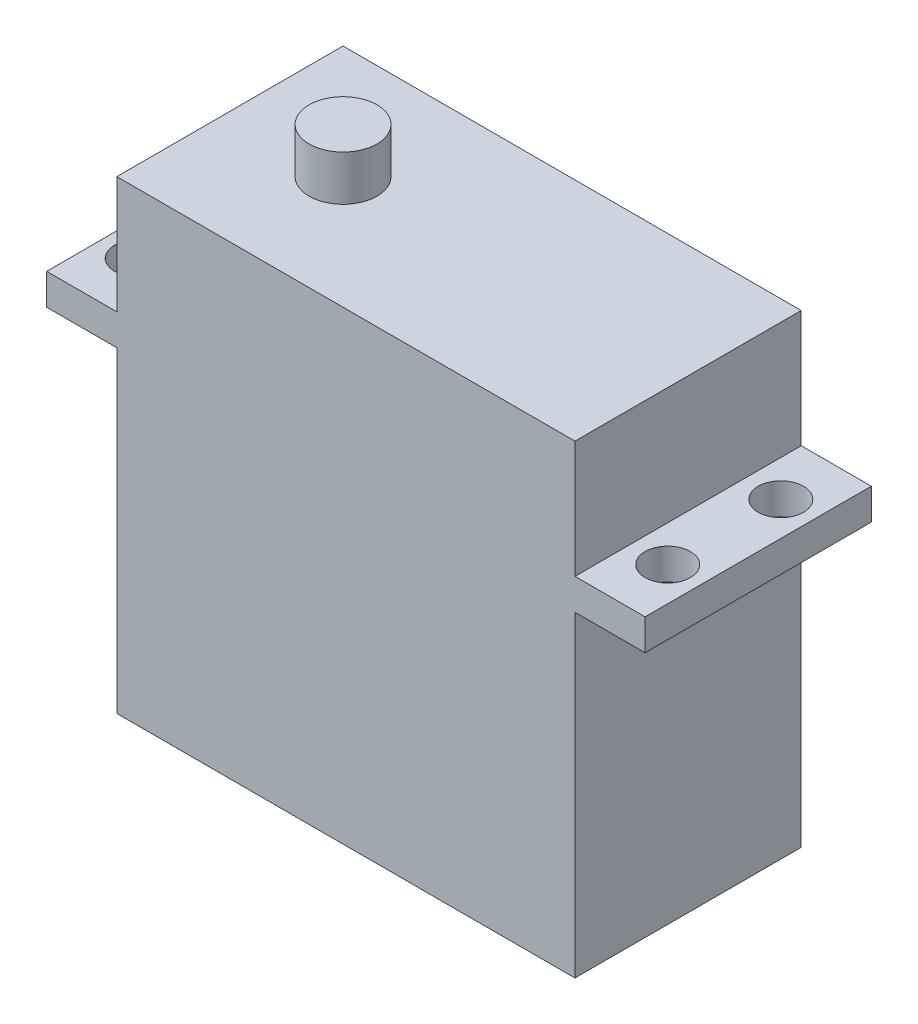
ISO-10303-21;
HEADER;
FILE_DESCRIPTION(('STEP AP214'),'2;1');
FILE_NAME('part.step','',(''),(''),'','','');
FILE_SCHEMA(('AUTOMOTIVE_DESIGN { 1 0 10303 214 1 1 1 1 }'));
ENDSEC;
DATA;
#1=APPLICATION_CONTEXT('core data for automotive mechanical design processes');
#2=APPLICATION_PROTOCOL_DEFINITION('international standard','automotive_design',2000,#1);
#3=PRODUCT_CONTEXT('',#1,'mechanical');
#4=PRODUCT('Part','Part','',(#3));
#5=PRODUCT_RELATED_PRODUCT_CATEGORY('part','',(#4));
#6=PRODUCT_DEFINITION_FORMATION('','',#4);
#7=PRODUCT_DEFINITION_CONTEXT('part definition',#1,'design');
#8=PRODUCT_DEFINITION('design','',#6,#7);
#9=PRODUCT_DEFINITION_SHAPE('','',#8);
#10=(LENGTH_UNIT() NAMED_UNIT(*) SI_UNIT(.MILLI.,.METRE.));
#11=(NAMED_UNIT(*) PLANE_ANGLE_UNIT() SI_UNIT($,.RADIAN.));
#12=(NAMED_UNIT(*) SI_UNIT($,.STERADIAN.) SOLID_ANGLE_UNIT());
#13=UNCERTAINTY_MEASURE_WITH_UNIT(LENGTH_MEASURE(1.E-05),#10,'distance_accuracy_value','');
#14=(GEOMETRIC_REPRESENTATION_CONTEXT(3) GLOBAL_UNCERTAINTY_ASSIGNED_CONTEXT((#13)) GLOBAL_UNIT_ASSIGNED_CONTEXT((#10,
#11,#12)) REPRESENTATION_CONTEXT('',''));
#15=CARTESIAN_POINT('',(0.,0.,0.));
#16=DIRECTION('',(0.,0.,1.));
#17=DIRECTION('',(1.,0.,0.));
#18=AXIS2_PLACEMENT_3D('',#15,#16,#17);
#19=CARTESIAN_POINT('',(-20.25,-20.55,-20.));
#20=DIRECTION('',(-1.,0.,0.));
#21=DIRECTION('',(0.,-1.,0.));
#22=AXIS2_PLACEMENT_3D('',#19,#20,#21);
#23=PLANE('',#22);
#24=DIRECTION('',(0.,-1.,0.));
#25=VECTOR('',#24,1.);
#26=CARTESIAN_POINT('',(-20.25,-20.55,0.));
#27=LINE('',#26,#25);
#28=CARTESIAN_POINT('',(-20.25,7.45,0.));
#29=VERTEX_POINT('',#28);
#30=CARTESIAN_POINT('',(-20.25,-20.55,0.));
#31=VERTEX_POINT('',#30);
#32=EDGE_CURVE('E200',#29,#31,#27,.T.);
#33=ORIENTED_EDGE('',*,*,#32,.F.);
#34=DIRECTION('',(0.,0.,-1.));
#35=VECTOR('',#34,1.);
#36=CARTESIAN_POINT('',(-20.25,7.45,0.));
#37=LINE('',#36,#35);
#38=CARTESIAN_POINT('',(-20.25,7.45,-20.));
#39=VERTEX_POINT('',#38);
#40=EDGE_CURVE('E145',#29,#39,#37,.T.);
#41=ORIENTED_EDGE('',*,*,#40,.T.);
#42=DIRECTION('',(0.,-1.,0.));
#43=VECTOR('',#42,1.);
#44=CARTESIAN_POINT('',(-20.25,-20.55,-20.));
#45=LINE('',#44,#43);
#46=CARTESIAN_POINT('',(-20.25,-20.55,-20.));
#47=VERTEX_POINT('',#46);
#48=EDGE_CURVE('E205',#39,#47,#45,.T.);
#49=ORIENTED_EDGE('',*,*,#48,.T.);
#50=DIRECTION('',(0.,0.,1.));
#51=VECTOR('',#50,1.);
#52=CARTESIAN_POINT('',(-20.25,-20.55,-20.));
#53=LINE('',#52,#51);
#54=EDGE_CURVE('E214',#47,#31,#53,.T.);
#55=ORIENTED_EDGE('',*,*,#54,.T.);
#56=EDGE_LOOP('',(#33,#41,#49,#55));
#57=FACE_BOUND('',#56,.T.);
#58=ADVANCED_FACE('F37',(#57),#23,.T.);
#59=CARTESIAN_POINT('',(-20.25,20.55,-20.));
#60=VERTEX_POINT('',#59);
#61=CARTESIAN_POINT('',(-20.25,10.2,-20.));
#62=VERTEX_POINT('',#61);
#63=EDGE_CURVE('E201',#60,#62,#45,.T.);
#64=ORIENTED_EDGE('',*,*,#63,.T.);
#65=DIRECTION('',(0.,0.,1.));
#66=VECTOR('',#65,1.);
#67=CARTESIAN_POINT('',(-20.25,10.2,0.));
#68=LINE('',#67,#66);
#69=CARTESIAN_POINT('',(-20.25,10.2,0.));
#70=VERTEX_POINT('',#69);
#71=EDGE_CURVE('E155',#62,#70,#68,.T.);
#72=ORIENTED_EDGE('',*,*,#71,.T.);
#73=CARTESIAN_POINT('',(-20.25,20.55,0.));
#74=VERTEX_POINT('',#73);
#75=EDGE_CURVE('E133',#74,#70,#27,.T.);
#76=ORIENTED_EDGE('',*,*,#75,.F.);
#77=DIRECTION('',(0.,0.,1.));
#78=VECTOR('',#77,1.);
#79=CARTESIAN_POINT('',(-20.25,20.55,-20.));
#80=LINE('',#79,#78);
#81=EDGE_CURVE('E11',#60,#74,#80,.T.);
#82=ORIENTED_EDGE('',*,*,#81,.F.);
#83=EDGE_LOOP('',(#64,#72,#76,#82));
#84=FACE_BOUND('',#83,.T.);
#85=ADVANCED_FACE('F310',(#84),#23,.T.);
#86=CARTESIAN_POINT('',(20.25,-20.55,-20.));
#87=DIRECTION('',(1.,0.,0.));
#88=DIRECTION('',(0.,0.,-1.));
#89=AXIS2_PLACEMENT_3D('',#86,#87,#88);
#90=PLANE('',#89);
#91=DIRECTION('',(0.,0.,1.));
#92=VECTOR('',#91,1.);
#93=CARTESIAN_POINT('',(20.25,10.2,0.));
#94=LINE('',#93,#92);
#95=CARTESIAN_POINT('',(20.25,10.2,-20.));
#96=VERTEX_POINT('',#95);
#97=CARTESIAN_POINT('',(20.25,10.2,0.));
#98=VERTEX_POINT('',#97);
#99=EDGE_CURVE('E61',#96,#98,#94,.T.);
#100=ORIENTED_EDGE('',*,*,#99,.F.);
#101=DIRECTION('',(0.,1.,0.));
#102=VECTOR('',#101,1.);
#103=CARTESIAN_POINT('',(20.25,-20.55,-20.));
#104=LINE('',#103,#102);
#105=CARTESIAN_POINT('',(20.25,20.55,-20.));
#106=VERTEX_POINT('',#105);
#107=EDGE_CURVE('E208',#96,#106,#104,.T.);
#108=ORIENTED_EDGE('',*,*,#107,.T.);
#109=DIRECTION('',(0.,0.,1.));
#110=VECTOR('',#109,1.);
#111=CARTESIAN_POINT('',(20.25,20.55,-20.));
#112=LINE('',#111,#110);
#113=CARTESIAN_POINT('',(20.25,20.55,0.));
#114=VERTEX_POINT('',#113);
#115=EDGE_CURVE('E45',#106,#114,#112,.T.);
#116=ORIENTED_EDGE('',*,*,#115,.T.);
#117=DIRECTION('',(0.,1.,0.));
#118=VECTOR('',#117,1.);
#119=CARTESIAN_POINT('',(20.25,-20.55,0.));
#120=LINE('',#119,#118);
#121=EDGE_CURVE('E219',#98,#114,#120,.T.);
#122=ORIENTED_EDGE('',*,*,#121,.F.);
#123=EDGE_LOOP('',(#100,#108,#116,#122));
#124=FACE_BOUND('',#123,.T.);
#125=ADVANCED_FACE('F262',(#124),#90,.T.);
#126=CARTESIAN_POINT('',(20.25,20.55,-20.));
#127=DIRECTION('',(0.,1.,0.));
#128=DIRECTION('',(0.,0.,1.));
#129=AXIS2_PLACEMENT_3D('',#126,#127,#128);
#130=PLANE('',#129);
#131=CARTESIAN_POINT('',(-10.25,20.55,-10.));
#132=DIRECTION('',(0.,1.,0.));
#133=DIRECTION('',(0.,0.,1.));
#134=AXIS2_PLACEMENT_3D('',#131,#132,#133);
#135=CIRCLE('',#134,3.);
#136=CARTESIAN_POINT('',(-10.25,20.55,-7.));
#137=VERTEX_POINT('',#136);
#138=EDGE_CURVE('E243',#137,#137,#135,.T.);
#139=ORIENTED_EDGE('',*,*,#138,.F.);
#140=EDGE_LOOP('',(#139));
#141=FACE_BOUND('',#140,.T.);
#142=DIRECTION('',(-1.,0.,0.));
#143=VECTOR('',#142,1.);
#144=CARTESIAN_POINT('',(20.25,20.55,0.));
#145=LINE('',#144,#143);
#146=EDGE_CURVE('E223',#114,#74,#145,.T.);
#147=ORIENTED_EDGE('',*,*,#146,.F.);
#148=ORIENTED_EDGE('',*,*,#115,.F.);
#149=DIRECTION('',(-1.,0.,0.));
#150=VECTOR('',#149,1.);
#151=CARTESIAN_POINT('',(20.25,20.55,-20.));
#152=LINE('',#151,#150);
#153=EDGE_CURVE('E211',#106,#60,#152,.T.);
#154=ORIENTED_EDGE('',*,*,#153,.T.);
#155=ORIENTED_EDGE('',*,*,#81,.T.);
#156=EDGE_LOOP('',(#147,#148,#154,#155));
#157=FACE_BOUND('',#156,.T.);
#158=ADVANCED_FACE('F258',(#141,#157),#130,.T.);
#159=DIRECTION('',(0.,0.,-1.));
#160=VECTOR('',#159,1.);
#161=CARTESIAN_POINT('',(20.25,7.45,0.));
#162=LINE('',#161,#160);
#163=CARTESIAN_POINT('',(20.25,7.45,0.));
#164=VERTEX_POINT('',#163);
#165=CARTESIAN_POINT('',(20.25,7.45,-20.));
#166=VERTEX_POINT('',#165);
#167=EDGE_CURVE('E175',#164,#166,#162,.T.);
#168=ORIENTED_EDGE('',*,*,#167,.F.);
#169=CARTESIAN_POINT('',(20.25,-20.55,0.));
#170=VERTEX_POINT('',#169);
#171=EDGE_CURVE('E220',#170,#164,#120,.T.);
#172=ORIENTED_EDGE('',*,*,#171,.F.);
#173=DIRECTION('',(0.,0.,1.));
#174=VECTOR('',#173,1.);
#175=CARTESIAN_POINT('',(20.25,-20.55,-20.));
#176=LINE('',#175,#174);
#177=CARTESIAN_POINT('',(20.25,-20.55,-20.));
#178=VERTEX_POINT('',#177);
#179=EDGE_CURVE('E227',#178,#170,#176,.T.);
#180=ORIENTED_EDGE('',*,*,#179,.F.);
#181=EDGE_CURVE('E209',#178,#166,#104,.T.);
#182=ORIENTED_EDGE('',*,*,#181,.T.);
#183=EDGE_LOOP('',(#168,#172,#180,#182));
#184=FACE_BOUND('',#183,.T.);
#185=ADVANCED_FACE('F261',(#184),#90,.T.);
#186=CARTESIAN_POINT('',(20.25,-20.55,-20.));
#187=DIRECTION('',(0.,-1.,0.));
#188=DIRECTION('',(1.,0.,0.));
#189=AXIS2_PLACEMENT_3D('',#186,#187,#188);
#190=PLANE('',#189);
#191=DIRECTION('',(1.,0.,0.));
#192=VECTOR('',#191,1.);
#193=CARTESIAN_POINT('',(20.25,-20.55,0.));
#194=LINE('',#193,#192);
#195=EDGE_CURVE('E216',#31,#170,#194,.T.);
#196=ORIENTED_EDGE('',*,*,#195,.F.);
#197=ORIENTED_EDGE('',*,*,#54,.F.);
#198=DIRECTION('',(1.,0.,0.));
#199=VECTOR('',#198,1.);
#200=CARTESIAN_POINT('',(20.25,-20.55,-20.));
#201=LINE('',#200,#199);
#202=EDGE_CURVE('E204',#47,#178,#201,.T.);
#203=ORIENTED_EDGE('',*,*,#202,.T.);
#204=ORIENTED_EDGE('',*,*,#179,.T.);
#205=EDGE_LOOP('',(#196,#197,#203,#204));
#206=FACE_BOUND('',#205,.T.);
#207=ADVANCED_FACE('F291',(#206),#190,.T.);
#208=CARTESIAN_POINT('',(0.,0.,-20.));
#209=DIRECTION('',(0.,0.,1.));
#210=DIRECTION('',(1.,0.,0.));
#211=AXIS2_PLACEMENT_3D('',#208,#209,#210);
#212=PLANE('',#211);
#213=ORIENTED_EDGE('',*,*,#63,.F.);
#214=ORIENTED_EDGE('',*,*,#153,.F.);
#215=ORIENTED_EDGE('',*,*,#107,.F.);
#216=DIRECTION('',(-1.,0.,0.));
#217=VECTOR('',#216,1.);
#218=CARTESIAN_POINT('',(26.45,10.2,-20.));
#219=LINE('',#218,#217);
#220=CARTESIAN_POINT('',(26.45,10.2,-20.));
#221=VERTEX_POINT('',#220);
#222=EDGE_CURVE('E191',#221,#96,#219,.T.);
#223=ORIENTED_EDGE('',*,*,#222,.F.);
#224=DIRECTION('',(0.,1.,0.));
#225=VECTOR('',#224,1.);
#226=CARTESIAN_POINT('',(26.45,10.2,-20.));
#227=LINE('',#226,#225);
#228=CARTESIAN_POINT('',(26.45,7.45,-20.));
#229=VERTEX_POINT('',#228);
#230=EDGE_CURVE('E181',#229,#221,#227,.T.);
#231=ORIENTED_EDGE('',*,*,#230,.F.);
#232=DIRECTION('',(-1.,0.,0.));
#233=VECTOR('',#232,1.);
#234=CARTESIAN_POINT('',(26.45,7.45,-20.));
#235=LINE('',#234,#233);
#236=EDGE_CURVE('E194',#229,#166,#235,.T.);
#237=ORIENTED_EDGE('',*,*,#236,.T.);
#238=ORIENTED_EDGE('',*,*,#181,.F.);
#239=ORIENTED_EDGE('',*,*,#202,.F.);
#240=ORIENTED_EDGE('',*,*,#48,.F.);
#241=DIRECTION('',(1.,0.,0.));
#242=VECTOR('',#241,1.);
#243=CARTESIAN_POINT('',(-26.45,7.45,-20.));
#244=LINE('',#243,#242);
#245=CARTESIAN_POINT('',(-26.45,7.45,-20.));
#246=VERTEX_POINT('',#245);
#247=EDGE_CURVE('E161',#246,#39,#244,.T.);
#248=ORIENTED_EDGE('',*,*,#247,.F.);
#249=DIRECTION('',(0.,1.,0.));
#250=VECTOR('',#249,1.);
#251=CARTESIAN_POINT('',(-26.45,10.2,-20.));
#252=LINE('',#251,#250);
#253=CARTESIAN_POINT('',(-26.45,10.2,-20.));
#254=VERTEX_POINT('',#253);
#255=EDGE_CURVE('E148',#246,#254,#252,.T.);
#256=ORIENTED_EDGE('',*,*,#255,.T.);
#257=DIRECTION('',(1.,0.,0.));
#258=VECTOR('',#257,1.);
#259=CARTESIAN_POINT('',(-26.45,10.2,-20.));
#260=LINE('',#259,#258);
#261=EDGE_CURVE('E135',#254,#62,#260,.T.);
#262=ORIENTED_EDGE('',*,*,#261,.T.);
#263=EDGE_LOOP('',(#213,#214,#215,#223,#231,#237,#238,#239,#240,#248,#256,#262));
#264=FACE_BOUND('',#263,.T.);
#265=ADVANCED_FACE('F272',(#264),#212,.F.);
#266=CARTESIAN_POINT('',(0.,0.,0.));
#267=DIRECTION('',(0.,0.,1.));
#268=DIRECTION('',(1.,0.,0.));
#269=AXIS2_PLACEMENT_3D('',#266,#267,#268);
#270=PLANE('',#269);
#271=ORIENTED_EDGE('',*,*,#75,.T.);
#272=DIRECTION('',(1.,0.,0.));
#273=VECTOR('',#272,1.);
#274=CARTESIAN_POINT('',(-26.45,10.2,0.));
#275=LINE('',#274,#273);
#276=CARTESIAN_POINT('',(-26.45,10.2,0.));
#277=VERTEX_POINT('',#276);
#278=EDGE_CURVE('E53',#277,#70,#275,.T.);
#279=ORIENTED_EDGE('',*,*,#278,.F.);
#280=DIRECTION('',(0.,-1.,0.));
#281=VECTOR('',#280,1.);
#282=CARTESIAN_POINT('',(-26.45,10.2,0.));
#283=LINE('',#282,#281);
#284=CARTESIAN_POINT('',(-26.45,7.45,0.));
#285=VERTEX_POINT('',#284);
#286=EDGE_CURVE('E129',#277,#285,#283,.T.);
#287=ORIENTED_EDGE('',*,*,#286,.T.);
#288=DIRECTION('',(1.,0.,0.));
#289=VECTOR('',#288,1.);
#290=CARTESIAN_POINT('',(-26.45,7.45,0.));
#291=LINE('',#290,#289);
#292=EDGE_CURVE('E154',#285,#29,#291,.T.);
#293=ORIENTED_EDGE('',*,*,#292,.T.);
#294=ORIENTED_EDGE('',*,*,#32,.T.);
#295=ORIENTED_EDGE('',*,*,#195,.T.);
#296=ORIENTED_EDGE('',*,*,#171,.T.);
#297=DIRECTION('',(-1.,0.,0.));
#298=VECTOR('',#297,1.);
#299=CARTESIAN_POINT('',(26.45,7.45,0.));
#300=LINE('',#299,#298);
#301=CARTESIAN_POINT('',(26.45,7.45,0.));
#302=VERTEX_POINT('',#301);
#303=EDGE_CURVE('E197',#302,#164,#300,.T.);
#304=ORIENTED_EDGE('',*,*,#303,.F.);
#305=DIRECTION('',(0.,-1.,0.));
#306=VECTOR('',#305,1.);
#307=CARTESIAN_POINT('',(26.45,10.2,0.));
#308=LINE('',#307,#306);
#309=CARTESIAN_POINT('',(26.45,10.2,0.));
#310=VERTEX_POINT('',#309);
#311=EDGE_CURVE('E176',#310,#302,#308,.T.);
#312=ORIENTED_EDGE('',*,*,#311,.F.);
#313=DIRECTION('',(-1.,0.,0.));
#314=VECTOR('',#313,1.);
#315=CARTESIAN_POINT('',(26.45,10.2,0.));
#316=LINE('',#315,#314);
#317=EDGE_CURVE('E185',#310,#98,#316,.T.);
#318=ORIENTED_EDGE('',*,*,#317,.T.);
#319=ORIENTED_EDGE('',*,*,#121,.T.);
#320=ORIENTED_EDGE('',*,*,#146,.T.);
#321=EDGE_LOOP('',(#271,#279,#287,#293,#294,#295,#296,#304,#312,#318,#319,#320));
#322=FACE_BOUND('',#321,.T.);
#323=ADVANCED_FACE('F128',(#322),#270,.T.);
#324=CARTESIAN_POINT('',(26.45,7.45,0.));
#325=DIRECTION('',(0.,1.,0.));
#326=DIRECTION('',(0.,0.,1.));
#327=AXIS2_PLACEMENT_3D('',#324,#325,#326);
#328=PLANE('',#327);
#329=CARTESIAN_POINT('',(23.45,7.45,-15.));
#330=DIRECTION('',(0.,1.,0.));
#331=DIRECTION('',(0.,0.,1.));
#332=AXIS2_PLACEMENT_3D('',#329,#330,#331);
#333=CIRCLE('',#332,2.);
#334=CARTESIAN_POINT('',(23.45,7.45,-13.));
#335=VERTEX_POINT('',#334);
#336=EDGE_CURVE('E166',#335,#335,#333,.T.);
#337=ORIENTED_EDGE('',*,*,#336,.T.);
#338=EDGE_LOOP('',(#337));
#339=FACE_BOUND('',#338,.T.);
#340=CARTESIAN_POINT('',(23.45,7.45,-5.));
#341=DIRECTION('',(0.,1.,0.));
#342=DIRECTION('',(0.,0.,1.));
#343=AXIS2_PLACEMENT_3D('',#340,#341,#342);
#344=CIRCLE('',#343,2.);
#345=CARTESIAN_POINT('',(23.45,7.45,-3.));
#346=VERTEX_POINT('',#345);
#347=EDGE_CURVE('E172',#346,#346,#344,.T.);
#348=ORIENTED_EDGE('',*,*,#347,.T.);
#349=EDGE_LOOP('',(#348));
#350=FACE_BOUND('',#349,.T.);
#351=ORIENTED_EDGE('',*,*,#167,.T.);
#352=ORIENTED_EDGE('',*,*,#236,.F.);
#353=DIRECTION('',(0.,0.,-1.));
#354=VECTOR('',#353,1.);
#355=CARTESIAN_POINT('',(26.45,7.45,0.));
#356=LINE('',#355,#354);
#357=EDGE_CURVE('E179',#302,#229,#356,.T.);
#358=ORIENTED_EDGE('',*,*,#357,.F.);
#359=ORIENTED_EDGE('',*,*,#303,.T.);
#360=EDGE_LOOP('',(#351,#352,#358,#359));
#361=FACE_BOUND('',#360,.T.);
#362=ADVANCED_FACE('F284',(#339,#350,#361),#328,.F.);
#363=CARTESIAN_POINT('',(26.45,10.2,0.));
#364=DIRECTION('',(0.,-1.,0.));
#365=DIRECTION('',(0.,0.,-1.));
#366=AXIS2_PLACEMENT_3D('',#363,#364,#365);
#367=PLANE('',#366);
#368=CARTESIAN_POINT('',(23.45,10.2,-15.));
#369=DIRECTION('',(0.,1.,0.));
#370=DIRECTION('',(0.,0.,-1.));
#371=AXIS2_PLACEMENT_3D('',#368,#369,#370);
#372=CIRCLE('',#371,2.);
#373=CARTESIAN_POINT('',(23.45,10.2,-13.));
#374=VERTEX_POINT('',#373);
#375=EDGE_CURVE('E134',#374,#374,#372,.T.);
#376=ORIENTED_EDGE('',*,*,#375,.F.);
#377=EDGE_LOOP('',(#376));
#378=FACE_BOUND('',#377,.T.);
#379=CARTESIAN_POINT('',(23.45,10.2,-5.));
#380=DIRECTION('',(0.,1.,0.));
#381=DIRECTION('',(0.,0.,1.));
#382=AXIS2_PLACEMENT_3D('',#379,#380,#381);
#383=CIRCLE('',#382,2.);
#384=CARTESIAN_POINT('',(23.45,10.2,-3.));
#385=VERTEX_POINT('',#384);
#386=EDGE_CURVE('E169',#385,#385,#383,.T.);
#387=ORIENTED_EDGE('',*,*,#386,.F.);
#388=EDGE_LOOP('',(#387));
#389=FACE_BOUND('',#388,.T.);
#390=ORIENTED_EDGE('',*,*,#99,.T.);
#391=ORIENTED_EDGE('',*,*,#317,.F.);
#392=DIRECTION('',(0.,0.,1.));
#393=VECTOR('',#392,1.);
#394=CARTESIAN_POINT('',(26.45,10.2,0.));
#395=LINE('',#394,#393);
#396=EDGE_CURVE('E183',#221,#310,#395,.T.);
#397=ORIENTED_EDGE('',*,*,#396,.F.);
#398=ORIENTED_EDGE('',*,*,#222,.T.);
#399=EDGE_LOOP('',(#390,#391,#397,#398));
#400=FACE_BOUND('',#399,.T.);
#401=ADVANCED_FACE('F276',(#378,#389,#400),#367,.F.);
#402=CARTESIAN_POINT('',(26.45,0.,0.));
#403=DIRECTION('',(1.,0.,0.));
#404=DIRECTION('',(0.,0.,-1.));
#405=AXIS2_PLACEMENT_3D('',#402,#403,#404);
#406=PLANE('',#405);
#407=ORIENTED_EDGE('',*,*,#311,.T.);
#408=ORIENTED_EDGE('',*,*,#357,.T.);
#409=ORIENTED_EDGE('',*,*,#230,.T.);
#410=ORIENTED_EDGE('',*,*,#396,.T.);
#411=EDGE_LOOP('',(#407,#408,#409,#410));
#412=FACE_BOUND('',#411,.T.);
#413=ADVANCED_FACE('F278',(#412),#406,.T.);
#414=CARTESIAN_POINT('',(23.45,4.,-5.));
#415=DIRECTION('',(0.,1.,0.));
#416=DIRECTION('',(0.,0.,1.));
#417=AXIS2_PLACEMENT_3D('',#414,#415,#416);
#418=CYLINDRICAL_SURFACE('',#417,2.);
#419=CARTESIAN_POINT('',(23.45,10.2,-3.));
#420=CARTESIAN_POINT('',(23.45,10.1713541666667,-3.));
#421=CARTESIAN_POINT('',(23.45,10.1427083333333,-3.));
#422=CARTESIAN_POINT('',(23.45,10.0854166666667,-3.));
#423=CARTESIAN_POINT('',(23.45,10.0567708333333,-3.));
#424=CARTESIAN_POINT('',(23.45,9.99947916666667,-3.));
#425=CARTESIAN_POINT('',(23.45,9.97083333333333,-3.));
#426=CARTESIAN_POINT('',(23.45,9.91354166666667,-3.));
#427=CARTESIAN_POINT('',(23.45,9.88489583333333,-3.));
#428=CARTESIAN_POINT('',(23.45,9.82760416666667,-3.));
#429=CARTESIAN_POINT('',(23.45,9.79895833333333,-3.));
#430=CARTESIAN_POINT('',(23.45,9.74166666666667,-3.));
#431=CARTESIAN_POINT('',(23.45,9.71302083333333,-3.));
#432=CARTESIAN_POINT('',(23.45,9.65572916666667,-3.));
#433=CARTESIAN_POINT('',(23.45,9.62708333333333,-3.));
#434=CARTESIAN_POINT('',(23.45,9.56979166666667,-3.));
#435=CARTESIAN_POINT('',(23.45,9.54114583333333,-3.));
#436=CARTESIAN_POINT('',(23.45,9.48385416666667,-3.));
#437=CARTESIAN_POINT('',(23.45,9.45520833333333,-3.));
#438=CARTESIAN_POINT('',(23.45,9.39791666666667,-3.));
#439=CARTESIAN_POINT('',(23.45,9.36927083333333,-3.));
#440=CARTESIAN_POINT('',(23.45,9.31197916666667,-3.));
#441=CARTESIAN_POINT('',(23.45,9.28333333333333,-3.));
#442=CARTESIAN_POINT('',(23.45,9.22604166666667,-3.));
#443=CARTESIAN_POINT('',(23.45,9.19739583333333,-3.));
#444=CARTESIAN_POINT('',(23.45,9.14010416666667,-3.));
#445=CARTESIAN_POINT('',(23.45,9.11145833333333,-3.));
#446=CARTESIAN_POINT('',(23.45,9.05416666666667,-3.));
#447=CARTESIAN_POINT('',(23.45,9.02552083333333,-3.));
#448=CARTESIAN_POINT('',(23.45,8.96822916666667,-3.));
#449=CARTESIAN_POINT('',(23.45,8.93958333333333,-3.));
#450=CARTESIAN_POINT('',(23.45,8.88229166666667,-3.));
#451=CARTESIAN_POINT('',(23.45,8.85364583333333,-3.));
#452=CARTESIAN_POINT('',(23.45,8.79635416666667,-3.));
#453=CARTESIAN_POINT('',(23.45,8.76770833333333,-3.));
#454=CARTESIAN_POINT('',(23.45,8.71041666666667,-3.));
#455=CARTESIAN_POINT('',(23.45,8.68177083333333,-3.));
#456=CARTESIAN_POINT('',(23.45,8.62447916666667,-3.));
#457=CARTESIAN_POINT('',(23.45,8.59583333333333,-3.));
#458=CARTESIAN_POINT('',(23.45,8.53854166666667,-3.));
#459=CARTESIAN_POINT('',(23.45,8.50989583333333,-3.));
#460=CARTESIAN_POINT('',(23.45,8.45260416666667,-3.));
#461=CARTESIAN_POINT('',(23.45,8.42395833333333,-3.));
#462=CARTESIAN_POINT('',(23.45,8.36666666666667,-3.));
#463=CARTESIAN_POINT('',(23.45,8.33802083333333,-3.));
#464=CARTESIAN_POINT('',(23.45,8.28072916666667,-3.));
#465=CARTESIAN_POINT('',(23.45,8.25208333333333,-3.));
#466=CARTESIAN_POINT('',(23.45,8.19479166666667,-3.));
#467=CARTESIAN_POINT('',(23.45,8.16614583333333,-3.));
#468=CARTESIAN_POINT('',(23.45,8.10885416666667,-3.));
#469=CARTESIAN_POINT('',(23.45,8.08020833333333,-3.));
#470=CARTESIAN_POINT('',(23.45,8.02291666666667,-3.));
#471=CARTESIAN_POINT('',(23.45,7.99427083333333,-3.));
#472=CARTESIAN_POINT('',(23.45,7.93697916666667,-3.));
#473=CARTESIAN_POINT('',(23.45,7.90833333333333,-3.));
#474=CARTESIAN_POINT('',(23.45,7.85104166666667,-3.));
#475=CARTESIAN_POINT('',(23.45,7.82239583333333,-3.));
#476=CARTESIAN_POINT('',(23.45,7.76510416666667,-3.));
#477=CARTESIAN_POINT('',(23.45,7.73645833333333,-3.));
#478=CARTESIAN_POINT('',(23.45,7.67916666666667,-3.));
#479=CARTESIAN_POINT('',(23.45,7.65052083333333,-3.));
#480=CARTESIAN_POINT('',(23.45,7.59322916666667,-3.));
#481=CARTESIAN_POINT('',(23.45,7.56458333333333,-3.));
#482=CARTESIAN_POINT('',(23.45,7.50729166666667,-3.));
#483=CARTESIAN_POINT('',(23.45,7.47864583333333,-3.));
#484=CARTESIAN_POINT('',(23.45,7.45,-3.));
#485=B_SPLINE_CURVE_WITH_KNOTS('',3,(#419,#420,#421,#422,#423,#424,#425,#426,#427,#428,#429,
#430,#431,#432,#433,#434,#435,#436,#437,#438,#439,#440,#441,#442,#443,#444,#445,#446,#447,#448,
#449,#450,#451,#452,#453,#454,#455,#456,#457,#458,#459,#460,#461,#462,#463,#464,#465,#466,#467,
#468,#469,#470,#471,#472,#473,#474,#475,#476,#477,#478,#479,#480,#481,#482,#483,#484),
.UNSPECIFIED.,.F.,.F.,(4,2,2,2,2,2,2,2,2,2,2,2,2,2,2,2,2,2,2,2,2,2,2,2,2,2,2,2,2,2,2,2,4),(0.,
0.0859374999999992,0.171875,0.257812499999999,0.343749999999999,0.4296875,0.515625,0.6015625,
0.687499999999999,0.7734375,0.859374999999999,0.945312499999998,1.03125,1.1171875,1.203125,
1.2890625,1.375,1.4609375,1.546875,1.6328125,1.71875,1.8046875,1.890625,1.9765625,2.0625,
2.1484375,2.234375,2.3203125,2.40625,2.4921875,2.578125,2.6640625,2.75),.UNSPECIFIED.);
#486=EDGE_CURVE('BSEAM342',#385,#346,#485,.T.);
#487=ORIENTED_EDGE('',*,*,#386,.T.);
#488=ORIENTED_EDGE('',*,*,#347,.F.);
#489=ORIENTED_EDGE('',*,*,#486,.T.);
#490=ORIENTED_EDGE('',*,*,#486,.F.);
#491=EDGE_LOOP('',(#487,#489,#488,#490));
#492=FACE_BOUND('',#491,.T.);
#493=ADVANCED_FACE('F342',(#492),#418,.F.);
#494=CARTESIAN_POINT('',(23.45,4.,-15.));
#495=DIRECTION('',(0.,1.,0.));
#496=DIRECTION('',(0.,0.,1.));
#497=AXIS2_PLACEMENT_3D('',#494,#495,#496);
#498=CYLINDRICAL_SURFACE('',#497,2.);
#499=CARTESIAN_POINT('',(23.45,10.2,-13.));
#500=CARTESIAN_POINT('',(23.45,10.1713541666667,-13.));
#501=CARTESIAN_POINT('',(23.45,10.1427083333333,-13.));
#502=CARTESIAN_POINT('',(23.45,10.0854166666667,-13.));
#503=CARTESIAN_POINT('',(23.45,10.0567708333333,-13.));
#504=CARTESIAN_POINT('',(23.45,9.99947916666667,-13.));
#505=CARTESIAN_POINT('',(23.45,9.97083333333333,-13.));
#506=CARTESIAN_POINT('',(23.45,9.91354166666667,-13.));
#507=CARTESIAN_POINT('',(23.45,9.88489583333333,-13.));
#508=CARTESIAN_POINT('',(23.45,9.82760416666667,-13.));
#509=CARTESIAN_POINT('',(23.45,9.79895833333333,-13.));
#510=CARTESIAN_POINT('',(23.45,9.74166666666667,-13.));
#511=CARTESIAN_POINT('',(23.45,9.71302083333333,-13.));
#512=CARTESIAN_POINT('',(23.45,9.65572916666667,-13.));
#513=CARTESIAN_POINT('',(23.45,9.62708333333333,-13.));
#514=CARTESIAN_POINT('',(23.45,9.56979166666667,-13.));
#515=CARTESIAN_POINT('',(23.45,9.54114583333333,-13.));
#516=CARTESIAN_POINT('',(23.45,9.48385416666667,-13.));
#517=CARTESIAN_POINT('',(23.45,9.45520833333333,-13.));
#518=CARTESIAN_POINT('',(23.45,9.39791666666667,-13.));
#519=CARTESIAN_POINT('',(23.45,9.36927083333333,-13.));
#520=CARTESIAN_POINT('',(23.45,9.31197916666667,-13.));
#521=CARTESIAN_POINT('',(23.45,9.28333333333333,-13.));
#522=CARTESIAN_POINT('',(23.45,9.22604166666667,-13.));
#523=CARTESIAN_POINT('',(23.45,9.19739583333333,-13.));
#524=CARTESIAN_POINT('',(23.45,9.14010416666667,-13.));
#525=CARTESIAN_POINT('',(23.45,9.11145833333333,-13.));
#526=CARTESIAN_POINT('',(23.45,9.05416666666667,-13.));
#527=CARTESIAN_POINT('',(23.45,9.02552083333333,-13.));
#528=CARTESIAN_POINT('',(23.45,8.96822916666667,-13.));
#529=CARTESIAN_POINT('',(23.45,8.93958333333333,-13.));
#530=CARTESIAN_POINT('',(23.45,8.88229166666667,-13.));
#531=CARTESIAN_POINT('',(23.45,8.85364583333333,-13.));
#532=CARTESIAN_POINT('',(23.45,8.79635416666667,-13.));
#533=CARTESIAN_POINT('',(23.45,8.76770833333333,-13.));
#534=CARTESIAN_POINT('',(23.45,8.71041666666667,-13.));
#535=CARTESIAN_POINT('',(23.45,8.68177083333333,-13.));
#536=CARTESIAN_POINT('',(23.45,8.62447916666667,-13.));
#537=CARTESIAN_POINT('',(23.45,8.59583333333333,-13.));
#538=CARTESIAN_POINT('',(23.45,8.53854166666667,-13.));
#539=CARTESIAN_POINT('',(23.45,8.50989583333333,-13.));
#540=CARTESIAN_POINT('',(23.45,8.45260416666667,-13.));
#541=CARTESIAN_POINT('',(23.45,8.42395833333333,-13.));
#542=CARTESIAN_POINT('',(23.45,8.36666666666667,-13.));
#543=CARTESIAN_POINT('',(23.45,8.33802083333333,-13.));
#544=CARTESIAN_POINT('',(23.45,8.28072916666667,-13.));
#545=CARTESIAN_POINT('',(23.45,8.25208333333333,-13.));
#546=CARTESIAN_POINT('',(23.45,8.19479166666667,-13.));
#547=CARTESIAN_POINT('',(23.45,8.16614583333333,-13.));
#548=CARTESIAN_POINT('',(23.45,8.10885416666667,-13.));
#549=CARTESIAN_POINT('',(23.45,8.08020833333333,-13.));
#550=CARTESIAN_POINT('',(23.45,8.02291666666667,-13.));
#551=CARTESIAN_POINT('',(23.45,7.99427083333333,-13.));
#552=CARTESIAN_POINT('',(23.45,7.93697916666667,-13.));
#553=CARTESIAN_POINT('',(23.45,7.90833333333333,-13.));
#554=CARTESIAN_POINT('',(23.45,7.85104166666667,-13.));
#555=CARTESIAN_POINT('',(23.45,7.82239583333333,-13.));
#556=CARTESIAN_POINT('',(23.45,7.76510416666667,-13.));
#557=CARTESIAN_POINT('',(23.45,7.73645833333333,-13.));
#558=CARTESIAN_POINT('',(23.45,7.67916666666667,-13.));
#559=CARTESIAN_POINT('',(23.45,7.65052083333333,-13.));
#560=CARTESIAN_POINT('',(23.45,7.59322916666667,-13.));
#561=CARTESIAN_POINT('',(23.45,7.56458333333333,-13.));
#562=CARTESIAN_POINT('',(23.45,7.50729166666667,-13.));
#563=CARTESIAN_POINT('',(23.45,7.47864583333333,-13.));
#564=CARTESIAN_POINT('',(23.45,7.45,-13.));
#565=B_SPLINE_CURVE_WITH_KNOTS('',3,(#499,#500,#501,#502,#503,#504,#505,#506,#507,#508,#509,
#510,#511,#512,#513,#514,#515,#516,#517,#518,#519,#520,#521,#522,#523,#524,#525,#526,#527,#528,
#529,#530,#531,#532,#533,#534,#535,#536,#537,#538,#539,#540,#541,#542,#543,#544,#545,#546,#547,
#548,#549,#550,#551,#552,#553,#554,#555,#556,#557,#558,#559,#560,#561,#562,#563,#564),
.UNSPECIFIED.,.F.,.F.,(4,2,2,2,2,2,2,2,2,2,2,2,2,2,2,2,2,2,2,2,2,2,2,2,2,2,2,2,2,2,2,2,4),(0.,
0.0859374999999992,0.171875,0.257812499999999,0.343749999999999,0.4296875,0.515625,0.6015625,
0.687499999999999,0.7734375,0.859374999999999,0.945312499999998,1.03125,1.1171875,1.203125,
1.2890625,1.375,1.4609375,1.546875,1.6328125,1.71875,1.8046875,1.890625,1.9765625,2.0625,
2.1484375,2.234375,2.3203125,2.40625,2.4921875,2.578125,2.6640625,2.75),.UNSPECIFIED.);
#566=EDGE_CURVE('BSEAM306',#374,#335,#565,.T.);
#567=ORIENTED_EDGE('',*,*,#375,.T.);
#568=ORIENTED_EDGE('',*,*,#336,.F.);
#569=ORIENTED_EDGE('',*,*,#566,.T.);
#570=ORIENTED_EDGE('',*,*,#566,.F.);
#571=EDGE_LOOP('',(#567,#569,#568,#570));
#572=FACE_BOUND('',#571,.T.);
#573=ADVANCED_FACE('F306',(#572),#498,.F.);
#574=CARTESIAN_POINT('',(-26.45,10.2,0.));
#575=DIRECTION('',(0.,1.,0.));
#576=DIRECTION('',(0.,0.,1.));
#577=AXIS2_PLACEMENT_3D('',#574,#575,#576);
#578=PLANE('',#577);
#579=CARTESIAN_POINT('',(-23.45,10.2,-15.));
#580=DIRECTION('',(0.,-1.,0.));
#581=DIRECTION('',(0.,0.,-1.));
#582=AXIS2_PLACEMENT_3D('',#579,#580,#581);
#583=CIRCLE('',#582,2.);
#584=CARTESIAN_POINT('',(-23.45,10.2,-13.));
#585=VERTEX_POINT('',#584);
#586=EDGE_CURVE('E238',#585,#585,#583,.T.);
#587=ORIENTED_EDGE('',*,*,#586,.T.);
#588=EDGE_LOOP('',(#587));
#589=FACE_BOUND('',#588,.T.);
#590=CARTESIAN_POINT('',(-23.45,10.2,-5.));
#591=DIRECTION('',(0.,-1.,0.));
#592=DIRECTION('',(0.,0.,1.));
#593=AXIS2_PLACEMENT_3D('',#590,#591,#592);
#594=CIRCLE('',#593,2.);
#595=CARTESIAN_POINT('',(-23.45,10.2,-3.));
#596=VERTEX_POINT('',#595);
#597=EDGE_CURVE('E231',#596,#596,#594,.T.);
#598=ORIENTED_EDGE('',*,*,#597,.T.);
#599=EDGE_LOOP('',(#598));
#600=FACE_BOUND('',#599,.T.);
#601=ORIENTED_EDGE('',*,*,#71,.F.);
#602=ORIENTED_EDGE('',*,*,#261,.F.);
#603=DIRECTION('',(0.,0.,1.));
#604=VECTOR('',#603,1.);
#605=CARTESIAN_POINT('',(-26.45,10.2,0.));
#606=LINE('',#605,#604);
#607=EDGE_CURVE('E141',#254,#277,#606,.T.);
#608=ORIENTED_EDGE('',*,*,#607,.T.);
#609=ORIENTED_EDGE('',*,*,#278,.T.);
#610=EDGE_LOOP('',(#601,#602,#608,#609));
#611=FACE_BOUND('',#610,.T.);
#612=ADVANCED_FACE('F147',(#589,#600,#611),#578,.T.);
#613=CARTESIAN_POINT('',(-26.45,7.45,0.));
#614=DIRECTION('',(0.,-1.,0.));
#615=DIRECTION('',(0.,0.,-1.));
#616=AXIS2_PLACEMENT_3D('',#613,#614,#615);
#617=PLANE('',#616);
#618=CARTESIAN_POINT('',(-23.45,7.45,-15.));
#619=DIRECTION('',(0.,-1.,0.));
#620=DIRECTION('',(0.,0.,-1.));
#621=AXIS2_PLACEMENT_3D('',#618,#619,#620);
#622=CIRCLE('',#621,2.);
#623=CARTESIAN_POINT('',(-23.45,7.45,-13.));
#624=VERTEX_POINT('',#623);
#625=EDGE_CURVE('E40',#624,#624,#622,.F.);
#626=ORIENTED_EDGE('',*,*,#625,.T.);
#627=EDGE_LOOP('',(#626));
#628=FACE_BOUND('',#627,.T.);
#629=CARTESIAN_POINT('',(-23.45,7.45,-5.));
#630=DIRECTION('',(0.,-1.,0.));
#631=DIRECTION('',(0.,0.,-1.));
#632=AXIS2_PLACEMENT_3D('',#629,#630,#631);
#633=CIRCLE('',#632,2.);
#634=CARTESIAN_POINT('',(-23.45,7.45,-3.));
#635=VERTEX_POINT('',#634);
#636=EDGE_CURVE('E157',#635,#635,#633,.F.);
#637=ORIENTED_EDGE('',*,*,#636,.T.);
#638=EDGE_LOOP('',(#637));
#639=FACE_BOUND('',#638,.T.);
#640=ORIENTED_EDGE('',*,*,#40,.F.);
#641=ORIENTED_EDGE('',*,*,#292,.F.);
#642=DIRECTION('',(0.,0.,-1.));
#643=VECTOR('',#642,1.);
#644=CARTESIAN_POINT('',(-26.45,7.45,0.));
#645=LINE('',#644,#643);
#646=EDGE_CURVE('E144',#285,#246,#645,.T.);
#647=ORIENTED_EDGE('',*,*,#646,.T.);
#648=ORIENTED_EDGE('',*,*,#247,.T.);
#649=EDGE_LOOP('',(#640,#641,#647,#648));
#650=FACE_BOUND('',#649,.T.);
#651=ADVANCED_FACE('F296',(#628,#639,#650),#617,.T.);
#652=CARTESIAN_POINT('',(-26.45,0.,0.));
#653=DIRECTION('',(-1.,0.,0.));
#654=DIRECTION('',(0.,0.,-1.));
#655=AXIS2_PLACEMENT_3D('',#652,#653,#654);
#656=PLANE('',#655);
#657=ORIENTED_EDGE('',*,*,#286,.F.);
#658=ORIENTED_EDGE('',*,*,#607,.F.);
#659=ORIENTED_EDGE('',*,*,#255,.F.);
#660=ORIENTED_EDGE('',*,*,#646,.F.);
#661=EDGE_LOOP('',(#657,#658,#659,#660));
#662=FACE_BOUND('',#661,.T.);
#663=ADVANCED_FACE('F139',(#662),#656,.T.);
#664=CARTESIAN_POINT('',(-23.45,4.,-5.));
#665=DIRECTION('',(0.,1.,0.));
#666=DIRECTION('',(0.,0.,1.));
#667=AXIS2_PLACEMENT_3D('',#664,#665,#666);
#668=CYLINDRICAL_SURFACE('',#667,2.);
#669=CARTESIAN_POINT('',(-23.45,7.45,-3.));
#670=CARTESIAN_POINT('',(-23.45,7.47864583333333,-3.));
#671=CARTESIAN_POINT('',(-23.45,7.50729166666667,-3.));
#672=CARTESIAN_POINT('',(-23.45,7.56458333333334,-3.));
#673=CARTESIAN_POINT('',(-23.45,7.59322916666667,-3.));
#674=CARTESIAN_POINT('',(-23.45,7.65052083333334,-3.));
#675=CARTESIAN_POINT('',(-23.45,7.67916666666667,-3.));
#676=CARTESIAN_POINT('',(-23.45,7.73645833333334,-3.));
#677=CARTESIAN_POINT('',(-23.45,7.76510416666667,-3.));
#678=CARTESIAN_POINT('',(-23.45,7.82239583333334,-3.));
#679=CARTESIAN_POINT('',(-23.45,7.85104166666667,-3.));
#680=CARTESIAN_POINT('',(-23.45,7.90833333333334,-3.));
#681=CARTESIAN_POINT('',(-23.45,7.93697916666667,-3.));
#682=CARTESIAN_POINT('',(-23.45,7.99427083333334,-3.));
#683=CARTESIAN_POINT('',(-23.45,8.02291666666667,-3.));
#684=CARTESIAN_POINT('',(-23.45,8.08020833333333,-3.));
#685=CARTESIAN_POINT('',(-23.45,8.10885416666667,-3.));
#686=CARTESIAN_POINT('',(-23.45,8.16614583333334,-3.));
#687=CARTESIAN_POINT('',(-23.45,8.19479166666667,-3.));
#688=CARTESIAN_POINT('',(-23.45,8.25208333333333,-3.));
#689=CARTESIAN_POINT('',(-23.45,8.28072916666667,-3.));
#690=CARTESIAN_POINT('',(-23.45,8.33802083333333,-3.));
#691=CARTESIAN_POINT('',(-23.45,8.36666666666667,-3.));
#692=CARTESIAN_POINT('',(-23.45,8.42395833333333,-3.));
#693=CARTESIAN_POINT('',(-23.45,8.45260416666667,-3.));
#694=CARTESIAN_POINT('',(-23.45,8.50989583333334,-3.));
#695=CARTESIAN_POINT('',(-23.45,8.53854166666667,-3.));
#696=CARTESIAN_POINT('',(-23.45,8.59583333333333,-3.));
#697=CARTESIAN_POINT('',(-23.45,8.62447916666667,-3.));
#698=CARTESIAN_POINT('',(-23.45,8.68177083333333,-3.));
#699=CARTESIAN_POINT('',(-23.45,8.71041666666667,-3.));
#700=CARTESIAN_POINT('',(-23.45,8.76770833333333,-3.));
#701=CARTESIAN_POINT('',(-23.45,8.79635416666667,-3.));
#702=CARTESIAN_POINT('',(-23.45,8.85364583333334,-3.));
#703=CARTESIAN_POINT('',(-23.45,8.88229166666667,-3.));
#704=CARTESIAN_POINT('',(-23.45,8.93958333333333,-3.));
#705=CARTESIAN_POINT('',(-23.45,8.96822916666667,-3.));
#706=CARTESIAN_POINT('',(-23.45,9.02552083333333,-3.));
#707=CARTESIAN_POINT('',(-23.45,9.05416666666667,-3.));
#708=CARTESIAN_POINT('',(-23.45,9.11145833333334,-3.));
#709=CARTESIAN_POINT('',(-23.45,9.14010416666667,-3.));
#710=CARTESIAN_POINT('',(-23.45,9.19739583333334,-3.));
#711=CARTESIAN_POINT('',(-23.45,9.22604166666667,-3.));
#712=CARTESIAN_POINT('',(-23.45,9.28333333333334,-3.));
#713=CARTESIAN_POINT('',(-23.45,9.31197916666667,-3.));
#714=CARTESIAN_POINT('',(-23.45,9.36927083333333,-3.));
#715=CARTESIAN_POINT('',(-23.45,9.39791666666667,-3.));
#716=CARTESIAN_POINT('',(-23.45,9.45520833333334,-3.));
#717=CARTESIAN_POINT('',(-23.45,9.48385416666667,-3.));
#718=CARTESIAN_POINT('',(-23.45,9.54114583333333,-3.));
#719=CARTESIAN_POINT('',(-23.45,9.56979166666667,-3.));
#720=CARTESIAN_POINT('',(-23.45,9.62708333333334,-3.));
#721=CARTESIAN_POINT('',(-23.45,9.65572916666667,-3.));
#722=CARTESIAN_POINT('',(-23.45,9.71302083333333,-3.));
#723=CARTESIAN_POINT('',(-23.45,9.74166666666667,-3.));
#724=CARTESIAN_POINT('',(-23.45,9.79895833333334,-3.));
#725=CARTESIAN_POINT('',(-23.45,9.82760416666667,-3.));
#726=CARTESIAN_POINT('',(-23.45,9.88489583333333,-3.));
#727=CARTESIAN_POINT('',(-23.45,9.91354166666667,-3.));
#728=CARTESIAN_POINT('',(-23.45,9.97083333333333,-3.));
#729=CARTESIAN_POINT('',(-23.45,9.99947916666667,-3.));
#730=CARTESIAN_POINT('',(-23.45,10.0567708333333,-3.));
#731=CARTESIAN_POINT('',(-23.45,10.0854166666667,-3.));
#732=CARTESIAN_POINT('',(-23.45,10.1427083333333,-3.));
#733=CARTESIAN_POINT('',(-23.45,10.1713541666667,-3.));
#734=CARTESIAN_POINT('',(-23.45,10.2,-3.));
#735=B_SPLINE_CURVE_WITH_KNOTS('',3,(#669,#670,#671,#672,#673,#674,#675,#676,#677,#678,#679,
#680,#681,#682,#683,#684,#685,#686,#687,#688,#689,#690,#691,#692,#693,#694,#695,#696,#697,#698,
#699,#700,#701,#702,#703,#704,#705,#706,#707,#708,#709,#710,#711,#712,#713,#714,#715,#716,#717,
#718,#719,#720,#721,#722,#723,#724,#725,#726,#727,#728,#729,#730,#731,#732,#733,#734),
.UNSPECIFIED.,.F.,.F.,(4,2,2,2,2,2,2,2,2,2,2,2,2,2,2,2,2,2,2,2,2,2,2,2,2,2,2,2,2,2,2,2,4),(0.,
0.0859375000000009,0.171875,0.257812500000001,0.34375,0.429687500000001,0.515625,0.6015625,
0.687500000000001,0.7734375,0.859374999999999,0.9453125,1.03125,1.1171875,1.203125,1.2890625,
1.375,1.4609375,1.546875,1.6328125,1.71875,1.8046875,1.890625,1.9765625,2.0625,2.1484375,
2.234375,2.3203125,2.40625,2.4921875,2.578125,2.6640625,2.75),.UNSPECIFIED.);
#736=EDGE_CURVE('BSEAM304',#635,#596,#735,.T.);
#737=ORIENTED_EDGE('',*,*,#636,.F.);
#738=ORIENTED_EDGE('',*,*,#597,.F.);
#739=ORIENTED_EDGE('',*,*,#736,.T.);
#740=ORIENTED_EDGE('',*,*,#736,.F.);
#741=EDGE_LOOP('',(#737,#739,#738,#740));
#742=FACE_BOUND('',#741,.T.);
#743=ADVANCED_FACE('F304',(#742),#668,.F.);
#744=CARTESIAN_POINT('',(-23.45,4.,-15.));
#745=DIRECTION('',(0.,1.,0.));
#746=DIRECTION('',(0.,0.,1.));
#747=AXIS2_PLACEMENT_3D('',#744,#745,#746);
#748=CYLINDRICAL_SURFACE('',#747,2.);
#749=CARTESIAN_POINT('',(-23.45,7.45,-13.));
#750=CARTESIAN_POINT('',(-23.45,7.47864583333333,-13.));
#751=CARTESIAN_POINT('',(-23.45,7.50729166666667,-13.));
#752=CARTESIAN_POINT('',(-23.45,7.56458333333334,-13.));
#753=CARTESIAN_POINT('',(-23.45,7.59322916666667,-13.));
#754=CARTESIAN_POINT('',(-23.45,7.65052083333334,-13.));
#755=CARTESIAN_POINT('',(-23.45,7.67916666666667,-13.));
#756=CARTESIAN_POINT('',(-23.45,7.73645833333334,-13.));
#757=CARTESIAN_POINT('',(-23.45,7.76510416666667,-13.));
#758=CARTESIAN_POINT('',(-23.45,7.82239583333334,-13.));
#759=CARTESIAN_POINT('',(-23.45,7.85104166666667,-13.));
#760=CARTESIAN_POINT('',(-23.45,7.90833333333334,-13.));
#761=CARTESIAN_POINT('',(-23.45,7.93697916666667,-13.));
#762=CARTESIAN_POINT('',(-23.45,7.99427083333334,-13.));
#763=CARTESIAN_POINT('',(-23.45,8.02291666666667,-13.));
#764=CARTESIAN_POINT('',(-23.45,8.08020833333333,-13.));
#765=CARTESIAN_POINT('',(-23.45,8.10885416666667,-13.));
#766=CARTESIAN_POINT('',(-23.45,8.16614583333334,-13.));
#767=CARTESIAN_POINT('',(-23.45,8.19479166666667,-13.));
#768=CARTESIAN_POINT('',(-23.45,8.25208333333333,-13.));
#769=CARTESIAN_POINT('',(-23.45,8.28072916666667,-13.));
#770=CARTESIAN_POINT('',(-23.45,8.33802083333333,-13.));
#771=CARTESIAN_POINT('',(-23.45,8.36666666666667,-13.));
#772=CARTESIAN_POINT('',(-23.45,8.42395833333333,-13.));
#773=CARTESIAN_POINT('',(-23.45,8.45260416666667,-13.));
#774=CARTESIAN_POINT('',(-23.45,8.50989583333334,-13.));
#775=CARTESIAN_POINT('',(-23.45,8.53854166666667,-13.));
#776=CARTESIAN_POINT('',(-23.45,8.59583333333333,-13.));
#777=CARTESIAN_POINT('',(-23.45,8.62447916666667,-13.));
#778=CARTESIAN_POINT('',(-23.45,8.68177083333333,-13.));
#779=CARTESIAN_POINT('',(-23.45,8.71041666666667,-13.));
#780=CARTESIAN_POINT('',(-23.45,8.76770833333333,-13.));
#781=CARTESIAN_POINT('',(-23.45,8.79635416666667,-13.));
#782=CARTESIAN_POINT('',(-23.45,8.85364583333334,-13.));
#783=CARTESIAN_POINT('',(-23.45,8.88229166666667,-13.));
#784=CARTESIAN_POINT('',(-23.45,8.93958333333333,-13.));
#785=CARTESIAN_POINT('',(-23.45,8.96822916666667,-13.));
#786=CARTESIAN_POINT('',(-23.45,9.02552083333333,-13.));
#787=CARTESIAN_POINT('',(-23.45,9.05416666666667,-13.));
#788=CARTESIAN_POINT('',(-23.45,9.11145833333334,-13.));
#789=CARTESIAN_POINT('',(-23.45,9.14010416666667,-13.));
#790=CARTESIAN_POINT('',(-23.45,9.19739583333334,-13.));
#791=CARTESIAN_POINT('',(-23.45,9.22604166666667,-13.));
#792=CARTESIAN_POINT('',(-23.45,9.28333333333334,-13.));
#793=CARTESIAN_POINT('',(-23.45,9.31197916666667,-13.));
#794=CARTESIAN_POINT('',(-23.45,9.36927083333333,-13.));
#795=CARTESIAN_POINT('',(-23.45,9.39791666666667,-13.));
#796=CARTESIAN_POINT('',(-23.45,9.45520833333334,-13.));
#797=CARTESIAN_POINT('',(-23.45,9.48385416666667,-13.));
#798=CARTESIAN_POINT('',(-23.45,9.54114583333333,-13.));
#799=CARTESIAN_POINT('',(-23.45,9.56979166666667,-13.));
#800=CARTESIAN_POINT('',(-23.45,9.62708333333334,-13.));
#801=CARTESIAN_POINT('',(-23.45,9.65572916666667,-13.));
#802=CARTESIAN_POINT('',(-23.45,9.71302083333333,-13.));
#803=CARTESIAN_POINT('',(-23.45,9.74166666666667,-13.));
#804=CARTESIAN_POINT('',(-23.45,9.79895833333334,-13.));
#805=CARTESIAN_POINT('',(-23.45,9.82760416666667,-13.));
#806=CARTESIAN_POINT('',(-23.45,9.88489583333333,-13.));
#807=CARTESIAN_POINT('',(-23.45,9.91354166666667,-13.));
#808=CARTESIAN_POINT('',(-23.45,9.97083333333333,-13.));
#809=CARTESIAN_POINT('',(-23.45,9.99947916666667,-13.));
#810=CARTESIAN_POINT('',(-23.45,10.0567708333333,-13.));
#811=CARTESIAN_POINT('',(-23.45,10.0854166666667,-13.));
#812=CARTESIAN_POINT('',(-23.45,10.1427083333333,-13.));
#813=CARTESIAN_POINT('',(-23.45,10.1713541666667,-13.));
#814=CARTESIAN_POINT('',(-23.45,10.2,-13.));
#815=B_SPLINE_CURVE_WITH_KNOTS('',3,(#749,#750,#751,#752,#753,#754,#755,#756,#757,#758,#759,
#760,#761,#762,#763,#764,#765,#766,#767,#768,#769,#770,#771,#772,#773,#774,#775,#776,#777,#778,
#779,#780,#781,#782,#783,#784,#785,#786,#787,#788,#789,#790,#791,#792,#793,#794,#795,#796,#797,
#798,#799,#800,#801,#802,#803,#804,#805,#806,#807,#808,#809,#810,#811,#812,#813,#814),
.UNSPECIFIED.,.F.,.F.,(4,2,2,2,2,2,2,2,2,2,2,2,2,2,2,2,2,2,2,2,2,2,2,2,2,2,2,2,2,2,2,2,4),(0.,
0.0859375000000009,0.171875,0.257812500000001,0.34375,0.429687500000001,0.515625,0.6015625,
0.687500000000001,0.7734375,0.859374999999999,0.9453125,1.03125,1.1171875,1.203125,1.2890625,
1.375,1.4609375,1.546875,1.6328125,1.71875,1.8046875,1.890625,1.9765625,2.0625,2.1484375,
2.234375,2.3203125,2.40625,2.4921875,2.578125,2.6640625,2.75),.UNSPECIFIED.);
#816=EDGE_CURVE('BSEAM254',#624,#585,#815,.T.);
#817=ORIENTED_EDGE('',*,*,#625,.F.);
#818=ORIENTED_EDGE('',*,*,#586,.F.);
#819=ORIENTED_EDGE('',*,*,#816,.T.);
#820=ORIENTED_EDGE('',*,*,#816,.F.);
#821=EDGE_LOOP('',(#817,#819,#818,#820));
#822=FACE_BOUND('',#821,.T.);
#823=ADVANCED_FACE('F254',(#822),#748,.F.);
#824=CARTESIAN_POINT('',(-10.25,24.55,-10.));
#825=DIRECTION('',(0.,-1.,0.));
#826=DIRECTION('',(0.,0.,-1.));
#827=AXIS2_PLACEMENT_3D('',#824,#825,#826);
#828=CYLINDRICAL_SURFACE('',#827,3.);
#829=CARTESIAN_POINT('',(-10.25,24.55,-10.));
#830=DIRECTION('',(0.,1.,0.));
#831=DIRECTION('',(0.,0.,1.));
#832=AXIS2_PLACEMENT_3D('',#829,#830,#831);
#833=CIRCLE('',#832,3.);
#834=CARTESIAN_POINT('',(-10.25,24.55,-7.));
#835=VERTEX_POINT('',#834);
#836=EDGE_CURVE('E242',#835,#835,#833,.T.);
#837=ORIENTED_EDGE('',*,*,#836,.F.);
#838=EDGE_LOOP('',(#837));
#839=FACE_BOUND('',#838,.T.);
#840=ORIENTED_EDGE('',*,*,#138,.T.);
#841=EDGE_LOOP('',(#840));
#842=FACE_BOUND('',#841,.T.);
#843=ADVANCED_FACE('F251',(#839,#842),#828,.T.);
#844=CARTESIAN_POINT('',(-10.25,24.55,-10.));
#845=DIRECTION('',(0.,1.,0.));
#846=DIRECTION('',(0.,0.,1.));
#847=AXIS2_PLACEMENT_3D('',#844,#845,#846);
#848=PLANE('',#847);
#849=ORIENTED_EDGE('',*,*,#836,.T.);
#850=EDGE_LOOP('',(#849));
#851=FACE_BOUND('',#850,.T.);
#852=ADVANCED_FACE('F249',(#851),#848,.T.);
#853=CLOSED_SHELL('',(#58,#85,#125,#158,#185,#207,#265,#323,#362,#401,#413,#493,#573,#612,#651,
#663,#743,#823,#843,#852));
#854=MANIFOLD_SOLID_BREP('B2',#853);
#855=ADVANCED_BREP_SHAPE_REPRESENTATION('',(#18,#854),#14);
#856=SHAPE_DEFINITION_REPRESENTATION(#9,#855);
ENDSEC;
END-ISO-10303-21;
